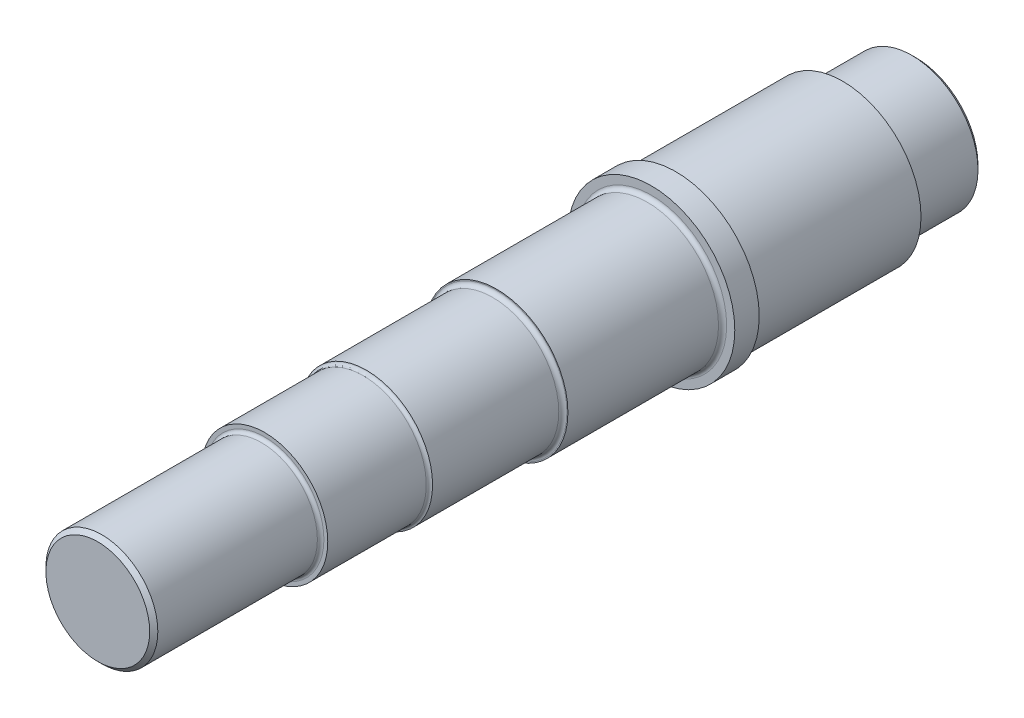
ISO-10303-21;
HEADER;
FILE_DESCRIPTION(('STEP AP214'),'2;1');
FILE_NAME('part.step','',(''),(''),'','','');
FILE_SCHEMA(('AUTOMOTIVE_DESIGN { 1 0 10303 214 1 1 1 1 }'));
ENDSEC;
DATA;
#1=APPLICATION_CONTEXT('core data for automotive mechanical design processes');
#2=APPLICATION_PROTOCOL_DEFINITION('international standard','automotive_design',2000,#1);
#3=PRODUCT_CONTEXT('',#1,'mechanical');
#4=PRODUCT('Part','Part','',(#3));
#5=PRODUCT_RELATED_PRODUCT_CATEGORY('part','',(#4));
#6=PRODUCT_DEFINITION_FORMATION('','',#4);
#7=PRODUCT_DEFINITION_CONTEXT('part definition',#1,'design');
#8=PRODUCT_DEFINITION('design','',#6,#7);
#9=PRODUCT_DEFINITION_SHAPE('','',#8);
#10=(LENGTH_UNIT() NAMED_UNIT(*) SI_UNIT(.MILLI.,.METRE.));
#11=(NAMED_UNIT(*) PLANE_ANGLE_UNIT() SI_UNIT($,.RADIAN.));
#12=(NAMED_UNIT(*) SI_UNIT($,.STERADIAN.) SOLID_ANGLE_UNIT());
#13=UNCERTAINTY_MEASURE_WITH_UNIT(LENGTH_MEASURE(1.E-05),#10,'distance_accuracy_value','');
#14=(GEOMETRIC_REPRESENTATION_CONTEXT(3) GLOBAL_UNCERTAINTY_ASSIGNED_CONTEXT((#13)) GLOBAL_UNIT_ASSIGNED_CONTEXT((#10,
#11,#12)) REPRESENTATION_CONTEXT('',''));
#15=CARTESIAN_POINT('',(0.,0.,0.));
#16=DIRECTION('',(0.,0.,1.));
#17=DIRECTION('',(1.,0.,0.));
#18=AXIS2_PLACEMENT_3D('',#15,#16,#17);
#19=CARTESIAN_POINT('',(0.,0.,320.));
#20=DIRECTION('',(0.,0.,1.));
#21=DIRECTION('',(1.,0.,0.));
#22=AXIS2_PLACEMENT_3D('',#19,#20,#21);
#23=PLANE('',#22);
#24=CARTESIAN_POINT('',(0.,0.,320.));
#25=DIRECTION('',(0.,0.,1.));
#26=DIRECTION('',(1.,0.,0.));
#27=AXIS2_PLACEMENT_3D('',#24,#25,#26);
#28=CIRCLE('',#27,29.1);
#29=CARTESIAN_POINT('',(29.1,0.,320.));
#30=VERTEX_POINT('',#29);
#31=EDGE_CURVE('E56',#30,#30,#28,.F.);
#32=ORIENTED_EDGE('',*,*,#31,.T.);
#33=EDGE_LOOP('',(#32));
#34=FACE_BOUND('',#33,.T.);
#35=CARTESIAN_POINT('',(0.,0.,320.));
#36=DIRECTION('',(0.,0.,1.));
#37=DIRECTION('',(1.,0.,0.));
#38=AXIS2_PLACEMENT_3D('',#35,#36,#37);
#39=CIRCLE('',#38,31.);
#40=CARTESIAN_POINT('',(31.,0.,320.));
#41=VERTEX_POINT('',#40);
#42=EDGE_CURVE('E95',#41,#41,#39,.T.);
#43=ORIENTED_EDGE('',*,*,#42,.T.);
#44=EDGE_LOOP('',(#43));
#45=FACE_BOUND('',#44,.T.);
#46=ADVANCED_FACE('F33',(#34,#45),#23,.T.);
#47=CARTESIAN_POINT('',(0.,0.,206.));
#48=DIRECTION('',(0.,0.,1.));
#49=DIRECTION('',(1.,0.,0.));
#50=AXIS2_PLACEMENT_3D('',#47,#48,#49);
#51=PLANE('',#50);
#52=CARTESIAN_POINT('',(0.,0.,206.));
#53=DIRECTION('',(0.,0.,1.));
#54=DIRECTION('',(1.,0.,0.));
#55=AXIS2_PLACEMENT_3D('',#52,#53,#54);
#56=CIRCLE('',#55,34.5);
#57=CARTESIAN_POINT('',(34.5,0.,206.));
#58=VERTEX_POINT('',#57);
#59=EDGE_CURVE('E68',#58,#58,#56,.F.);
#60=ORIENTED_EDGE('',*,*,#59,.T.);
#61=EDGE_LOOP('',(#60));
#62=FACE_BOUND('',#61,.T.);
#63=CARTESIAN_POINT('',(0.,0.,206.));
#64=DIRECTION('',(0.,0.,1.));
#65=DIRECTION('',(1.,0.,0.));
#66=AXIS2_PLACEMENT_3D('',#63,#64,#65);
#67=CIRCLE('',#66,35.);
#68=CARTESIAN_POINT('',(35.,0.,206.));
#69=VERTEX_POINT('',#68);
#70=EDGE_CURVE('E87',#69,#69,#67,.T.);
#71=ORIENTED_EDGE('',*,*,#70,.T.);
#72=EDGE_LOOP('',(#71));
#73=FACE_BOUND('',#72,.T.);
#74=ADVANCED_FACE('F118',(#62,#73),#51,.T.);
#75=CARTESIAN_POINT('',(0.,0.,130.));
#76=DIRECTION('',(0.,0.,1.));
#77=DIRECTION('',(1.,0.,0.));
#78=AXIS2_PLACEMENT_3D('',#75,#76,#77);
#79=PLANE('',#78);
#80=CARTESIAN_POINT('',(0.,0.,130.));
#81=DIRECTION('',(0.,0.,1.));
#82=DIRECTION('',(1.,0.,0.));
#83=AXIS2_PLACEMENT_3D('',#80,#81,#82);
#84=CIRCLE('',#83,37.);
#85=CARTESIAN_POINT('',(37.,0.,130.));
#86=VERTEX_POINT('',#85);
#87=EDGE_CURVE('E62',#86,#86,#84,.F.);
#88=ORIENTED_EDGE('',*,*,#87,.T.);
#89=EDGE_LOOP('',(#88));
#90=FACE_BOUND('',#89,.T.);
#91=CARTESIAN_POINT('',(0.,0.,130.));
#92=DIRECTION('',(0.,0.,1.));
#93=DIRECTION('',(1.,0.,0.));
#94=AXIS2_PLACEMENT_3D('',#91,#92,#93);
#95=CIRCLE('',#94,41.);
#96=CARTESIAN_POINT('',(41.,0.,130.));
#97=VERTEX_POINT('',#96);
#98=EDGE_CURVE('E81',#97,#97,#95,.T.);
#99=ORIENTED_EDGE('',*,*,#98,.T.);
#100=EDGE_LOOP('',(#99));
#101=FACE_BOUND('',#100,.T.);
#102=ADVANCED_FACE('F124',(#90,#101),#79,.T.);
#103=CARTESIAN_POINT('',(0.,0.,36.));
#104=DIRECTION('',(0.,0.,-1.));
#105=DIRECTION('',(-1.,0.,0.));
#106=AXIS2_PLACEMENT_3D('',#103,#104,#105);
#107=CYLINDRICAL_SURFACE('',#106,32.5);
#108=CARTESIAN_POINT('',(0.,0.,1.99999999999993));
#109=DIRECTION('',(0.,0.,1.));
#110=DIRECTION('',(1.,0.,0.));
#111=AXIS2_PLACEMENT_3D('',#108,#109,#110);
#112=CIRCLE('',#111,32.5);
#113=CARTESIAN_POINT('',(32.5,0.,1.99999999999993));
#114=VERTEX_POINT('',#113);
#115=EDGE_CURVE('E48',#114,#114,#112,.T.);
#116=ORIENTED_EDGE('',*,*,#115,.T.);
#117=EDGE_LOOP('',(#116));
#118=FACE_BOUND('',#117,.T.);
#119=CARTESIAN_POINT('',(0.,0.,36.));
#120=DIRECTION('',(0.,0.,1.));
#121=DIRECTION('',(1.,0.,0.));
#122=AXIS2_PLACEMENT_3D('',#119,#120,#121);
#123=CIRCLE('',#122,32.5);
#124=CARTESIAN_POINT('',(32.5,0.,36.));
#125=VERTEX_POINT('',#124);
#126=EDGE_CURVE('E74',#125,#125,#123,.T.);
#127=ORIENTED_EDGE('',*,*,#126,.F.);
#128=EDGE_LOOP('',(#127));
#129=FACE_BOUND('',#128,.T.);
#130=ADVANCED_FACE('F146',(#118,#129),#107,.T.);
#131=CARTESIAN_POINT('',(0.,0.,0.));
#132=DIRECTION('',(0.,0.,1.));
#133=DIRECTION('',(1.,0.,0.));
#134=AXIS2_PLACEMENT_3D('',#131,#132,#133);
#135=PLANE('',#134);
#136=CARTESIAN_POINT('',(0.,0.,0.));
#137=DIRECTION('',(0.,0.,1.));
#138=DIRECTION('',(1.,0.,0.));
#139=AXIS2_PLACEMENT_3D('',#136,#137,#138);
#140=CIRCLE('',#139,30.5000000000001);
#141=CARTESIAN_POINT('',(30.5000000000001,0.,0.));
#142=VERTEX_POINT('',#141);
#143=EDGE_CURVE('E44',#142,#142,#140,.F.);
#144=ORIENTED_EDGE('',*,*,#143,.T.);
#145=EDGE_LOOP('',(#144));
#146=FACE_BOUND('',#145,.T.);
#147=ADVANCED_FACE('F167',(#146),#135,.F.);
#148=CARTESIAN_POINT('',(0.,0.,36.));
#149=DIRECTION('',(0.,0.,1.));
#150=DIRECTION('',(1.,0.,0.));
#151=AXIS2_PLACEMENT_3D('',#148,#149,#150);
#152=PLANE('',#151);
#153=CARTESIAN_POINT('',(0.,0.,36.));
#154=DIRECTION('',(0.,0.,1.));
#155=DIRECTION('',(1.,0.,0.));
#156=AXIS2_PLACEMENT_3D('',#153,#154,#155);
#157=CIRCLE('',#156,38.5);
#158=CARTESIAN_POINT('',(38.5,0.,36.));
#159=VERTEX_POINT('',#158);
#160=EDGE_CURVE('E78',#159,#159,#157,.T.);
#161=ORIENTED_EDGE('',*,*,#160,.F.);
#162=EDGE_LOOP('',(#161));
#163=FACE_BOUND('',#162,.T.);
#164=ORIENTED_EDGE('',*,*,#126,.T.);
#165=EDGE_LOOP('',(#164));
#166=FACE_BOUND('',#165,.T.);
#167=ADVANCED_FACE('F170',(#163,#166),#152,.F.);
#168=CARTESIAN_POINT('',(0.,0.,118.));
#169=DIRECTION('',(0.,0.,-1.));
#170=DIRECTION('',(-1.,0.,0.));
#171=AXIS2_PLACEMENT_3D('',#168,#169,#170);
#172=CYLINDRICAL_SURFACE('',#171,38.5);
#173=CARTESIAN_POINT('',(0.,0.,118.));
#174=DIRECTION('',(0.,0.,1.));
#175=DIRECTION('',(1.,0.,0.));
#176=AXIS2_PLACEMENT_3D('',#173,#174,#175);
#177=CIRCLE('',#176,38.5);
#178=CARTESIAN_POINT('',(38.5,0.,118.));
#179=VERTEX_POINT('',#178);
#180=EDGE_CURVE('E77',#179,#179,#177,.T.);
#181=ORIENTED_EDGE('',*,*,#180,.F.);
#182=EDGE_LOOP('',(#181));
#183=FACE_BOUND('',#182,.T.);
#184=ORIENTED_EDGE('',*,*,#160,.T.);
#185=EDGE_LOOP('',(#184));
#186=FACE_BOUND('',#185,.T.);
#187=ADVANCED_FACE('F172',(#183,#186),#172,.T.);
#188=CARTESIAN_POINT('',(0.,0.,118.));
#189=DIRECTION('',(0.,0.,1.));
#190=DIRECTION('',(1.,0.,0.));
#191=AXIS2_PLACEMENT_3D('',#188,#189,#190);
#192=PLANE('',#191);
#193=CARTESIAN_POINT('',(0.,0.,118.));
#194=DIRECTION('',(0.,0.,1.));
#195=DIRECTION('',(1.,0.,0.));
#196=AXIS2_PLACEMENT_3D('',#193,#194,#195);
#197=CIRCLE('',#196,41.);
#198=CARTESIAN_POINT('',(41.,0.,118.));
#199=VERTEX_POINT('',#198);
#200=EDGE_CURVE('E84',#199,#199,#197,.T.);
#201=ORIENTED_EDGE('',*,*,#200,.F.);
#202=EDGE_LOOP('',(#201));
#203=FACE_BOUND('',#202,.T.);
#204=ORIENTED_EDGE('',*,*,#180,.T.);
#205=EDGE_LOOP('',(#204));
#206=FACE_BOUND('',#205,.T.);
#207=ADVANCED_FACE('F179',(#203,#206),#192,.F.);
#208=CARTESIAN_POINT('',(0.,0.,130.));
#209=DIRECTION('',(0.,0.,-1.));
#210=DIRECTION('',(-1.,0.,0.));
#211=AXIS2_PLACEMENT_3D('',#208,#209,#210);
#212=CYLINDRICAL_SURFACE('',#211,41.);
#213=ORIENTED_EDGE('',*,*,#98,.F.);
#214=EDGE_LOOP('',(#213));
#215=FACE_BOUND('',#214,.T.);
#216=ORIENTED_EDGE('',*,*,#200,.T.);
#217=EDGE_LOOP('',(#216));
#218=FACE_BOUND('',#217,.T.);
#219=ADVANCED_FACE('F186',(#215,#218),#212,.T.);
#220=CARTESIAN_POINT('',(0.,0.,206.));
#221=DIRECTION('',(0.,0.,-1.));
#222=DIRECTION('',(-1.,0.,0.));
#223=AXIS2_PLACEMENT_3D('',#220,#221,#222);
#224=CYLINDRICAL_SURFACE('',#223,35.);
#225=CARTESIAN_POINT('',(0.,0.,132.));
#226=DIRECTION('',(0.,0.,1.));
#227=DIRECTION('',(1.,0.,0.));
#228=AXIS2_PLACEMENT_3D('',#225,#226,#227);
#229=CIRCLE('',#228,35.);
#230=CARTESIAN_POINT('',(35.,0.,132.));
#231=VERTEX_POINT('',#230);
#232=EDGE_CURVE('E65',#231,#231,#229,.T.);
#233=ORIENTED_EDGE('',*,*,#232,.T.);
#234=EDGE_LOOP('',(#233));
#235=FACE_BOUND('',#234,.T.);
#236=ORIENTED_EDGE('',*,*,#70,.F.);
#237=EDGE_LOOP('',(#236));
#238=FACE_BOUND('',#237,.T.);
#239=ADVANCED_FACE('F114',(#235,#238),#224,.T.);
#240=CARTESIAN_POINT('',(0.,0.,270.));
#241=DIRECTION('',(0.,0.,-1.));
#242=DIRECTION('',(-1.,0.,0.));
#243=AXIS2_PLACEMENT_3D('',#240,#241,#242);
#244=CYLINDRICAL_SURFACE('',#243,32.5);
#245=CARTESIAN_POINT('',(0.,0.,208.));
#246=DIRECTION('',(0.,0.,1.));
#247=DIRECTION('',(1.,0.,0.));
#248=AXIS2_PLACEMENT_3D('',#245,#246,#247);
#249=CIRCLE('',#248,32.5);
#250=CARTESIAN_POINT('',(32.5,0.,208.));
#251=VERTEX_POINT('',#250);
#252=EDGE_CURVE('E71',#251,#251,#249,.T.);
#253=ORIENTED_EDGE('',*,*,#252,.T.);
#254=EDGE_LOOP('',(#253));
#255=FACE_BOUND('',#254,.T.);
#256=CARTESIAN_POINT('',(0.,0.,270.));
#257=DIRECTION('',(0.,0.,1.));
#258=DIRECTION('',(1.,0.,0.));
#259=AXIS2_PLACEMENT_3D('',#256,#257,#258);
#260=CIRCLE('',#259,32.5);
#261=CARTESIAN_POINT('',(32.5,0.,270.));
#262=VERTEX_POINT('',#261);
#263=EDGE_CURVE('E92',#262,#262,#260,.T.);
#264=ORIENTED_EDGE('',*,*,#263,.F.);
#265=EDGE_LOOP('',(#264));
#266=FACE_BOUND('',#265,.T.);
#267=ADVANCED_FACE('F103',(#255,#266),#244,.T.);
#268=CARTESIAN_POINT('',(0.,0.,320.));
#269=DIRECTION('',(0.,0.,-1.));
#270=DIRECTION('',(-1.,0.,0.));
#271=AXIS2_PLACEMENT_3D('',#268,#269,#270);
#272=CYLINDRICAL_SURFACE('',#271,31.);
#273=CARTESIAN_POINT('',(0.,0.,271.596871942267));
#274=DIRECTION('',(0.,0.,-1.));
#275=DIRECTION('',(-1.,0.,0.));
#276=AXIS2_PLACEMENT_3D('',#273,#274,#275);
#277=CIRCLE('',#276,31.);
#278=CARTESIAN_POINT('',(-31.,0.,271.596871942267));
#279=VERTEX_POINT('',#278);
#280=EDGE_CURVE('E53',#279,#279,#277,.F.);
#281=ORIENTED_EDGE('',*,*,#280,.T.);
#282=EDGE_LOOP('',(#281));
#283=FACE_BOUND('',#282,.T.);
#284=ORIENTED_EDGE('',*,*,#42,.F.);
#285=EDGE_LOOP('',(#284));
#286=FACE_BOUND('',#285,.T.);
#287=ADVANCED_FACE('F100',(#283,#286),#272,.T.);
#288=CARTESIAN_POINT('',(0.,0.,402.));
#289=DIRECTION('',(0.,0.,-1.));
#290=DIRECTION('',(-1.,0.,0.));
#291=AXIS2_PLACEMENT_3D('',#288,#289,#290);
#292=CYLINDRICAL_SURFACE('',#291,27.5);
#293=CARTESIAN_POINT('',(0.,0.,400.));
#294=DIRECTION('',(0.,0.,1.));
#295=DIRECTION('',(1.,0.,0.));
#296=AXIS2_PLACEMENT_3D('',#293,#294,#295);
#297=CIRCLE('',#296,27.5);
#298=CARTESIAN_POINT('',(27.5,0.,400.));
#299=VERTEX_POINT('',#298);
#300=EDGE_CURVE('E10',#299,#299,#297,.F.);
#301=ORIENTED_EDGE('',*,*,#300,.T.);
#302=EDGE_LOOP('',(#301));
#303=FACE_BOUND('',#302,.T.);
#304=CARTESIAN_POINT('',(0.,0.,321.6));
#305=DIRECTION('',(0.,0.,1.));
#306=DIRECTION('',(1.,0.,0.));
#307=AXIS2_PLACEMENT_3D('',#304,#305,#306);
#308=CIRCLE('',#307,27.5);
#309=CARTESIAN_POINT('',(27.5,0.,321.6));
#310=VERTEX_POINT('',#309);
#311=EDGE_CURVE('E59',#310,#310,#308,.T.);
#312=ORIENTED_EDGE('',*,*,#311,.T.);
#313=EDGE_LOOP('',(#312));
#314=FACE_BOUND('',#313,.T.);
#315=ADVANCED_FACE('F102',(#303,#314),#292,.T.);
#316=CARTESIAN_POINT('',(0.,0.,402.));
#317=DIRECTION('',(0.,0.,1.));
#318=DIRECTION('',(1.,0.,0.));
#319=AXIS2_PLACEMENT_3D('',#316,#317,#318);
#320=PLANE('',#319);
#321=CARTESIAN_POINT('',(0.,0.,402.));
#322=DIRECTION('',(0.,0.,1.));
#323=DIRECTION('',(1.,0.,0.));
#324=AXIS2_PLACEMENT_3D('',#321,#322,#323);
#325=CIRCLE('',#324,25.5);
#326=CARTESIAN_POINT('',(25.5,0.,402.));
#327=VERTEX_POINT('',#326);
#328=EDGE_CURVE('E40',#327,#327,#325,.T.);
#329=ORIENTED_EDGE('',*,*,#328,.T.);
#330=EDGE_LOOP('',(#329));
#331=FACE_BOUND('',#330,.T.);
#332=ADVANCED_FACE('F111',(#331),#320,.T.);
#333=CARTESIAN_POINT('',(0.,0.,208.));
#334=DIRECTION('',(0.,0.,1.));
#335=DIRECTION('',(1.,0.,0.));
#336=AXIS2_PLACEMENT_3D('',#333,#334,#335);
#337=TOROIDAL_SURFACE('',#336,34.5,2.);
#338=ORIENTED_EDGE('',*,*,#59,.F.);
#339=EDGE_LOOP('',(#338));
#340=FACE_BOUND('',#339,.T.);
#341=ORIENTED_EDGE('',*,*,#252,.F.);
#342=EDGE_LOOP('',(#341));
#343=FACE_BOUND('',#342,.T.);
#344=ADVANCED_FACE('F129',(#340,#343),#337,.F.);
#345=CARTESIAN_POINT('',(0.,0.,132.));
#346=DIRECTION('',(0.,0.,1.));
#347=DIRECTION('',(1.,0.,0.));
#348=AXIS2_PLACEMENT_3D('',#345,#346,#347);
#349=TOROIDAL_SURFACE('',#348,37.,2.);
#350=ORIENTED_EDGE('',*,*,#87,.F.);
#351=EDGE_LOOP('',(#350));
#352=FACE_BOUND('',#351,.T.);
#353=ORIENTED_EDGE('',*,*,#232,.F.);
#354=EDGE_LOOP('',(#353));
#355=FACE_BOUND('',#354,.T.);
#356=ADVANCED_FACE('F134',(#352,#355),#349,.F.);
#357=CARTESIAN_POINT('',(0.,0.,321.6));
#358=DIRECTION('',(0.,0.,1.));
#359=DIRECTION('',(1.,0.,0.));
#360=AXIS2_PLACEMENT_3D('',#357,#358,#359);
#361=TOROIDAL_SURFACE('',#360,29.1,1.6);
#362=ORIENTED_EDGE('',*,*,#31,.F.);
#363=EDGE_LOOP('',(#362));
#364=FACE_BOUND('',#363,.T.);
#365=ORIENTED_EDGE('',*,*,#311,.F.);
#366=EDGE_LOOP('',(#365));
#367=FACE_BOUND('',#366,.T.);
#368=ADVANCED_FACE('F140',(#364,#367),#361,.F.);
#369=CARTESIAN_POINT('',(0.,0.,271.596871942267));
#370=DIRECTION('',(0.,0.,-1.));
#371=DIRECTION('',(-1.,0.,0.));
#372=AXIS2_PLACEMENT_3D('',#369,#370,#371);
#373=TOROIDAL_SURFACE('',#372,32.6,1.6);
#374=ORIENTED_EDGE('',*,*,#263,.T.);
#375=EDGE_LOOP('',(#374));
#376=FACE_BOUND('',#375,.T.);
#377=ORIENTED_EDGE('',*,*,#280,.F.);
#378=EDGE_LOOP('',(#377));
#379=FACE_BOUND('',#378,.T.);
#380=ADVANCED_FACE('F151',(#376,#379),#373,.F.);
#381=CARTESIAN_POINT('',(0.,0.,1.99999999999993));
#382=DIRECTION('',(0.,0.,1.));
#383=DIRECTION('',(1.,0.,0.));
#384=AXIS2_PLACEMENT_3D('',#381,#382,#383);
#385=CONICAL_SURFACE('',#384,32.5,0.785398163397447);
#386=ORIENTED_EDGE('',*,*,#143,.F.);
#387=EDGE_LOOP('',(#386));
#388=FACE_BOUND('',#387,.T.);
#389=ORIENTED_EDGE('',*,*,#115,.F.);
#390=EDGE_LOOP('',(#389));
#391=FACE_BOUND('',#390,.T.);
#392=ADVANCED_FACE('F154',(#388,#391),#385,.T.);
#393=CARTESIAN_POINT('',(0.,0.,402.));
#394=DIRECTION('',(0.,0.,-1.));
#395=DIRECTION('',(-1.,0.,0.));
#396=AXIS2_PLACEMENT_3D('',#393,#394,#395);
#397=CONICAL_SURFACE('',#396,25.5,0.785398163397456);
#398=ORIENTED_EDGE('',*,*,#300,.F.);
#399=EDGE_LOOP('',(#398));
#400=FACE_BOUND('',#399,.T.);
#401=ORIENTED_EDGE('',*,*,#328,.F.);
#402=EDGE_LOOP('',(#401));
#403=FACE_BOUND('',#402,.T.);
#404=ADVANCED_FACE('F35',(#400,#403),#397,.T.);
#405=CLOSED_SHELL('',(#46,#74,#102,#130,#147,#167,#187,#207,#219,#239,#267,#287,#315,#332,#344,
#356,#368,#380,#392,#404));
#406=MANIFOLD_SOLID_BREP('B2',#405);
#407=ADVANCED_BREP_SHAPE_REPRESENTATION('',(#18,#406),#14);
#408=SHAPE_DEFINITION_REPRESENTATION(#9,#407);
ENDSEC;
END-ISO-10303-21;
